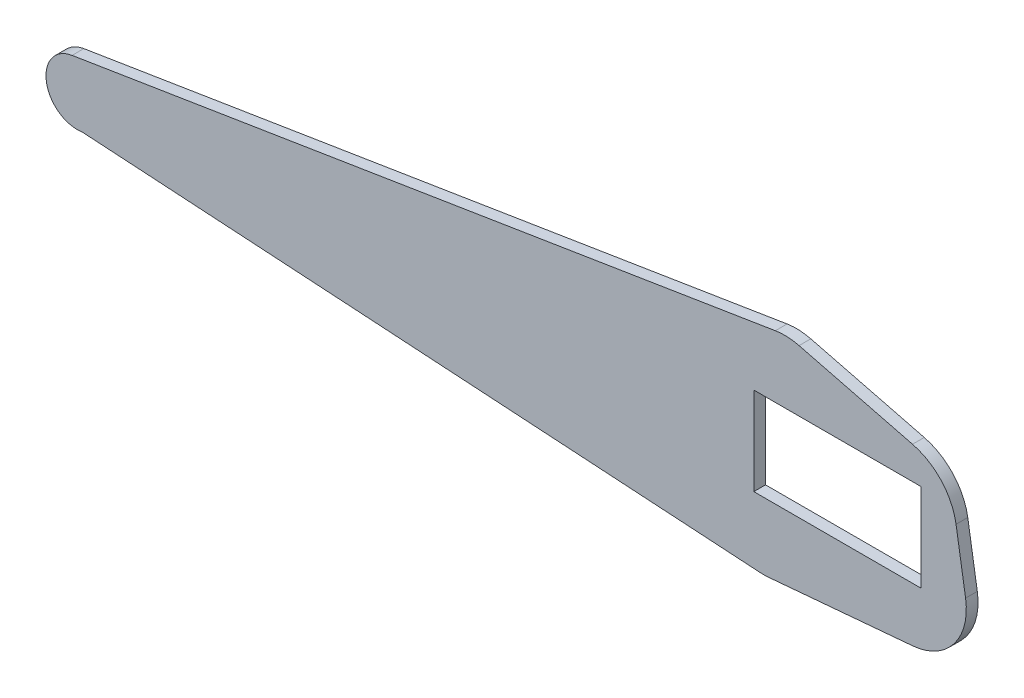
ISO-10303-21;
HEADER;
FILE_DESCRIPTION(('STEP AP214'),'2;1');
FILE_NAME('part.step','',(''),(''),'','','');
FILE_SCHEMA(('AUTOMOTIVE_DESIGN { 1 0 10303 214 1 1 1 1 }'));
ENDSEC;
DATA;
#1=APPLICATION_CONTEXT('core data for automotive mechanical design processes');
#2=APPLICATION_PROTOCOL_DEFINITION('international standard','automotive_design',2000,#1);
#3=PRODUCT_CONTEXT('',#1,'mechanical');
#4=PRODUCT('Part','Part','',(#3));
#5=PRODUCT_RELATED_PRODUCT_CATEGORY('part','',(#4));
#6=PRODUCT_DEFINITION_FORMATION('','',#4);
#7=PRODUCT_DEFINITION_CONTEXT('part definition',#1,'design');
#8=PRODUCT_DEFINITION('design','',#6,#7);
#9=PRODUCT_DEFINITION_SHAPE('','',#8);
#10=(LENGTH_UNIT() NAMED_UNIT(*) SI_UNIT(.MILLI.,.METRE.));
#11=(NAMED_UNIT(*) PLANE_ANGLE_UNIT() SI_UNIT($,.RADIAN.));
#12=(NAMED_UNIT(*) SI_UNIT($,.STERADIAN.) SOLID_ANGLE_UNIT());
#13=UNCERTAINTY_MEASURE_WITH_UNIT(LENGTH_MEASURE(1.E-05),#10,'distance_accuracy_value','');
#14=(GEOMETRIC_REPRESENTATION_CONTEXT(3) GLOBAL_UNCERTAINTY_ASSIGNED_CONTEXT((#13)) GLOBAL_UNIT_ASSIGNED_CONTEXT((#10,
#11,#12)) REPRESENTATION_CONTEXT('',''));
#15=CARTESIAN_POINT('',(0.,0.,0.));
#16=DIRECTION('',(0.,0.,1.));
#17=DIRECTION('',(1.,0.,0.));
#18=AXIS2_PLACEMENT_3D('',#15,#16,#17);
#19=CARTESIAN_POINT('',(-103.698118325608,-5.14144113501677,1.6));
#20=DIRECTION('',(0.,0.,1.));
#21=DIRECTION('',(1.,0.,0.));
#22=AXIS2_PLACEMENT_3D('',#19,#20,#21);
#23=PLANE('',#22);
#24=CARTESIAN_POINT('',(-103.698118325608,-5.14144113501677,1.6));
#25=DIRECTION('',(0.,0.,1.));
#26=DIRECTION('',(1.,0.,0.));
#27=AXIS2_PLACEMENT_3D('',#24,#25,#26);
#28=CIRCLE('',#27,4.23582990680659);
#29=CARTESIAN_POINT('',(-104.371088501529,-0.959412184648588,1.6));
#30=VERTEX_POINT('',#29);
#31=CARTESIAN_POINT('',(-103.025148149686,-9.32347008538495,1.6));
#32=VERTEX_POINT('',#31);
#33=EDGE_CURVE('E168',#30,#32,#28,.T.);
#34=ORIENTED_EDGE('',*,*,#33,.T.);
#35=DIRECTION('',(0.998039277444374,-0.0625907395571467,0.));
#36=VECTOR('',#35,1.);
#37=CARTESIAN_POINT('',(-10.5446241465617,-15.1232662685674,1.6));
#38=LINE('',#37,#36);
#39=CARTESIAN_POINT('',(-10.5446241465617,-15.1232662685674,1.6));
#40=VERTEX_POINT('',#39);
#41=EDGE_CURVE('E171',#32,#40,#38,.T.);
#42=ORIENTED_EDGE('',*,*,#41,.T.);
#43=CARTESIAN_POINT('',(-10.0438982301045,-7.13895204901238,1.6));
#44=DIRECTION('',(0.,0.,1.));
#45=DIRECTION('',(-1.,0.,0.));
#46=AXIS2_PLACEMENT_3D('',#43,#44,#45);
#47=CIRCLE('',#46,8.);
#48=CARTESIAN_POINT('',(-9.34255378012987,-15.1081499987743,1.6));
#49=VERTEX_POINT('',#48);
#50=EDGE_CURVE('E174',#40,#49,#47,.T.);
#51=ORIENTED_EDGE('',*,*,#50,.T.);
#52=DIRECTION('',(0.996149743720242,0.0876680562468202,0.));
#53=VECTOR('',#52,1.);
#54=CARTESIAN_POINT('',(10.2844156812776,-13.3808411543517,1.6));
#55=LINE('',#54,#53);
#56=CARTESIAN_POINT('',(10.2844156812776,-13.3808411543517,1.6));
#57=VERTEX_POINT('',#56);
#58=EDGE_CURVE('E176',#49,#57,#55,.T.);
#59=ORIENTED_EDGE('',*,*,#58,.T.);
#60=CARTESIAN_POINT('',(9.58307123130313,-5.41164320458975,1.6));
#61=DIRECTION('',(0.,0.,1.));
#62=DIRECTION('',(1.,0.,0.));
#63=AXIS2_PLACEMENT_3D('',#60,#61,#62);
#64=CIRCLE('',#63,8.);
#65=CARTESIAN_POINT('',(17.4814600568753,-4.14063810622176,1.6));
#66=VERTEX_POINT('',#65);
#67=EDGE_CURVE('E178',#57,#66,#64,.T.);
#68=ORIENTED_EDGE('',*,*,#67,.T.);
#69=DIRECTION('',(-0.158875637295991,0.987298603196517,0.));
#70=VECTOR('',#69,1.);
#71=CARTESIAN_POINT('',(16.1817821293699,3.93593187184714,1.6));
#72=LINE('',#71,#70);
#73=CARTESIAN_POINT('',(16.1817821293699,3.93593187184714,1.6));
#74=VERTEX_POINT('',#73);
#75=EDGE_CURVE('E180',#66,#74,#72,.T.);
#76=ORIENTED_EDGE('',*,*,#75,.T.);
#77=CARTESIAN_POINT('',(8.28339330379777,2.66492677347925,1.6));
#78=DIRECTION('',(0.,0.,1.));
#79=DIRECTION('',(1.,0.,0.));
#80=AXIS2_PLACEMENT_3D('',#77,#78,#79);
#81=CIRCLE('',#80,8.);
#82=CARTESIAN_POINT('',(10.2441764541634,10.4209134571477,1.6));
#83=VERTEX_POINT('',#82);
#84=EDGE_CURVE('E182',#74,#83,#81,.T.);
#85=ORIENTED_EDGE('',*,*,#84,.T.);
#86=DIRECTION('',(-0.969498335458556,0.245097893795703,0.));
#87=VECTOR('',#86,1.);
#88=CARTESIAN_POINT('',(-5.22744232145128,14.3322777543537,1.6));
#89=LINE('',#88,#87);
#90=CARTESIAN_POINT('',(-5.22744232145128,14.3322777543537,1.6));
#91=VERTEX_POINT('',#90);
#92=EDGE_CURVE('E184',#83,#91,#89,.T.);
#93=ORIENTED_EDGE('',*,*,#92,.T.);
#94=CARTESIAN_POINT('',(-7.18822547181693,6.57629107068522,1.6));
#95=DIRECTION('',(0.,0.,1.));
#96=DIRECTION('',(1.,0.,0.));
#97=AXIS2_PLACEMENT_3D('',#94,#95,#96);
#98=CIRCLE('',#97,8.);
#99=CARTESIAN_POINT('',(-8.45923057018489,14.4746798962573,1.6));
#100=VERTEX_POINT('',#99);
#101=EDGE_CURVE('E186',#91,#100,#98,.T.);
#102=ORIENTED_EDGE('',*,*,#101,.T.);
#103=DIRECTION('',(-0.987298603196517,-0.158875637295991,0.));
#104=VECTOR('',#103,1.);
#105=CARTESIAN_POINT('',(-104.371088501529,-0.959412184648588,1.6));
#106=LINE('',#105,#104);
#107=EDGE_CURVE('E188',#100,#30,#106,.T.);
#108=ORIENTED_EDGE('',*,*,#107,.T.);
#109=EDGE_LOOP('',(#34,#42,#51,#59,#68,#76,#85,#93,#102,#108));
#110=FACE_BOUND('',#109,.T.);
#111=DIRECTION('',(1.,0.,0.));
#112=VECTOR('',#111,1.);
#113=CARTESIAN_POINT('',(11.4,-6.,1.6));
#114=LINE('',#113,#112);
#115=CARTESIAN_POINT('',(-11.4,-6.00000000000001,1.6));
#116=VERTEX_POINT('',#115);
#117=CARTESIAN_POINT('',(11.4,-6.,1.6));
#118=VERTEX_POINT('',#117);
#119=EDGE_CURVE('E140',#116,#118,#114,.T.);
#120=ORIENTED_EDGE('',*,*,#119,.F.);
#121=DIRECTION('',(0.,-1.,0.));
#122=VECTOR('',#121,1.);
#123=CARTESIAN_POINT('',(-11.4,6.,1.6));
#124=LINE('',#123,#122);
#125=CARTESIAN_POINT('',(-11.4,6.,1.6));
#126=VERTEX_POINT('',#125);
#127=EDGE_CURVE('E132',#126,#116,#124,.T.);
#128=ORIENTED_EDGE('',*,*,#127,.F.);
#129=DIRECTION('',(-1.,0.,0.));
#130=VECTOR('',#129,1.);
#131=CARTESIAN_POINT('',(11.4,6.,1.6));
#132=LINE('',#131,#130);
#133=CARTESIAN_POINT('',(11.4,6.,1.6));
#134=VERTEX_POINT('',#133);
#135=EDGE_CURVE('E154',#134,#126,#132,.T.);
#136=ORIENTED_EDGE('',*,*,#135,.F.);
#137=DIRECTION('',(0.,1.,0.));
#138=VECTOR('',#137,1.);
#139=CARTESIAN_POINT('',(11.4,6.,1.6));
#140=LINE('',#139,#138);
#141=EDGE_CURVE('E152',#118,#134,#140,.T.);
#142=ORIENTED_EDGE('',*,*,#141,.F.);
#143=EDGE_LOOP('',(#120,#128,#136,#142));
#144=FACE_BOUND('',#143,.T.);
#145=ADVANCED_FACE('F31',(#110,#144),#23,.T.);
#146=CARTESIAN_POINT('',(-103.698118325608,-5.14144113501677,0.));
#147=DIRECTION('',(0.,0.,1.));
#148=DIRECTION('',(1.,0.,0.));
#149=AXIS2_PLACEMENT_3D('',#146,#147,#148);
#150=PLANE('',#149);
#151=CARTESIAN_POINT('',(-103.698118325608,-5.14144113501677,0.));
#152=DIRECTION('',(0.,0.,1.));
#153=DIRECTION('',(1.,0.,0.));
#154=AXIS2_PLACEMENT_3D('',#151,#152,#153);
#155=CIRCLE('',#154,4.23582990680659);
#156=CARTESIAN_POINT('',(-104.371088501529,-0.959412184648588,0.));
#157=VERTEX_POINT('',#156);
#158=CARTESIAN_POINT('',(-103.025148149686,-9.32347008538495,0.));
#159=VERTEX_POINT('',#158);
#160=EDGE_CURVE('E148',#157,#159,#155,.T.);
#161=ORIENTED_EDGE('',*,*,#160,.F.);
#162=DIRECTION('',(-0.987298603196517,-0.158875637295991,0.));
#163=VECTOR('',#162,1.);
#164=CARTESIAN_POINT('',(-104.371088501529,-0.959412184648588,0.));
#165=LINE('',#164,#163);
#166=CARTESIAN_POINT('',(-8.45923057018489,14.4746798962573,0.));
#167=VERTEX_POINT('',#166);
#168=EDGE_CURVE('E172',#167,#157,#165,.T.);
#169=ORIENTED_EDGE('',*,*,#168,.F.);
#170=CARTESIAN_POINT('',(-7.18822547181693,6.57629107068522,0.));
#171=DIRECTION('',(0.,0.,1.));
#172=DIRECTION('',(1.,0.,0.));
#173=AXIS2_PLACEMENT_3D('',#170,#171,#172);
#174=CIRCLE('',#173,8.);
#175=CARTESIAN_POINT('',(-5.22744232145128,14.3322777543537,0.));
#176=VERTEX_POINT('',#175);
#177=EDGE_CURVE('E207',#176,#167,#174,.T.);
#178=ORIENTED_EDGE('',*,*,#177,.F.);
#179=DIRECTION('',(-0.969498335458556,0.245097893795703,0.));
#180=VECTOR('',#179,1.);
#181=CARTESIAN_POINT('',(-5.22744232145128,14.3322777543537,0.));
#182=LINE('',#181,#180);
#183=CARTESIAN_POINT('',(10.2441764541634,10.4209134571477,0.));
#184=VERTEX_POINT('',#183);
#185=EDGE_CURVE('E205',#184,#176,#182,.T.);
#186=ORIENTED_EDGE('',*,*,#185,.F.);
#187=CARTESIAN_POINT('',(8.28339330379777,2.66492677347925,0.));
#188=DIRECTION('',(0.,0.,1.));
#189=DIRECTION('',(1.,0.,0.));
#190=AXIS2_PLACEMENT_3D('',#187,#188,#189);
#191=CIRCLE('',#190,8.);
#192=CARTESIAN_POINT('',(16.1817821293699,3.93593187184714,0.));
#193=VERTEX_POINT('',#192);
#194=EDGE_CURVE('E203',#193,#184,#191,.T.);
#195=ORIENTED_EDGE('',*,*,#194,.F.);
#196=DIRECTION('',(-0.158875637295991,0.987298603196517,0.));
#197=VECTOR('',#196,1.);
#198=CARTESIAN_POINT('',(16.1817821293699,3.93593187184714,0.));
#199=LINE('',#198,#197);
#200=CARTESIAN_POINT('',(17.4814600568753,-4.14063810622176,0.));
#201=VERTEX_POINT('',#200);
#202=EDGE_CURVE('E201',#201,#193,#199,.T.);
#203=ORIENTED_EDGE('',*,*,#202,.F.);
#204=CARTESIAN_POINT('',(9.58307123130313,-5.41164320458975,0.));
#205=DIRECTION('',(0.,0.,1.));
#206=DIRECTION('',(1.,0.,0.));
#207=AXIS2_PLACEMENT_3D('',#204,#205,#206);
#208=CIRCLE('',#207,8.);
#209=CARTESIAN_POINT('',(10.2844156812776,-13.3808411543517,0.));
#210=VERTEX_POINT('',#209);
#211=EDGE_CURVE('E199',#210,#201,#208,.T.);
#212=ORIENTED_EDGE('',*,*,#211,.F.);
#213=DIRECTION('',(0.996149743720242,0.0876680562468202,0.));
#214=VECTOR('',#213,1.);
#215=CARTESIAN_POINT('',(10.2844156812776,-13.3808411543517,0.));
#216=LINE('',#215,#214);
#217=CARTESIAN_POINT('',(-9.34255378012987,-15.1081499987743,0.));
#218=VERTEX_POINT('',#217);
#219=EDGE_CURVE('E197',#218,#210,#216,.T.);
#220=ORIENTED_EDGE('',*,*,#219,.F.);
#221=CARTESIAN_POINT('',(-10.0438982301045,-7.13895204901238,0.));
#222=DIRECTION('',(0.,0.,1.));
#223=DIRECTION('',(-1.,0.,0.));
#224=AXIS2_PLACEMENT_3D('',#221,#222,#223);
#225=CIRCLE('',#224,8.);
#226=CARTESIAN_POINT('',(-10.5446241465617,-15.1232662685674,0.));
#227=VERTEX_POINT('',#226);
#228=EDGE_CURVE('E195',#227,#218,#225,.T.);
#229=ORIENTED_EDGE('',*,*,#228,.F.);
#230=DIRECTION('',(0.998039277444374,-0.0625907395571467,0.));
#231=VECTOR('',#230,1.);
#232=CARTESIAN_POINT('',(-10.5446241465617,-15.1232662685674,0.));
#233=LINE('',#232,#231);
#234=EDGE_CURVE('E193',#159,#227,#233,.T.);
#235=ORIENTED_EDGE('',*,*,#234,.F.);
#236=EDGE_LOOP('',(#161,#169,#178,#186,#195,#203,#212,#220,#229,#235));
#237=FACE_BOUND('',#236,.T.);
#238=DIRECTION('',(0.,-1.,0.));
#239=VECTOR('',#238,1.);
#240=CARTESIAN_POINT('',(-11.4,6.,0.));
#241=LINE('',#240,#239);
#242=CARTESIAN_POINT('',(-11.4,6.,0.));
#243=VERTEX_POINT('',#242);
#244=CARTESIAN_POINT('',(-11.4,-6.00000000000001,0.));
#245=VERTEX_POINT('',#244);
#246=EDGE_CURVE('E54',#243,#245,#241,.T.);
#247=ORIENTED_EDGE('',*,*,#246,.T.);
#248=DIRECTION('',(1.,0.,0.));
#249=VECTOR('',#248,1.);
#250=CARTESIAN_POINT('',(11.4,-6.,0.));
#251=LINE('',#250,#249);
#252=CARTESIAN_POINT('',(11.4,-6.,0.));
#253=VERTEX_POINT('',#252);
#254=EDGE_CURVE('E147',#245,#253,#251,.T.);
#255=ORIENTED_EDGE('',*,*,#254,.T.);
#256=DIRECTION('',(0.,1.,0.));
#257=VECTOR('',#256,1.);
#258=CARTESIAN_POINT('',(11.4,6.,0.));
#259=LINE('',#258,#257);
#260=CARTESIAN_POINT('',(11.4,6.,0.));
#261=VERTEX_POINT('',#260);
#262=EDGE_CURVE('E160',#253,#261,#259,.T.);
#263=ORIENTED_EDGE('',*,*,#262,.T.);
#264=DIRECTION('',(-1.,0.,0.));
#265=VECTOR('',#264,1.);
#266=CARTESIAN_POINT('',(11.4,6.,0.));
#267=LINE('',#266,#265);
#268=EDGE_CURVE('E141',#261,#243,#267,.T.);
#269=ORIENTED_EDGE('',*,*,#268,.T.);
#270=EDGE_LOOP('',(#247,#255,#263,#269));
#271=FACE_BOUND('',#270,.T.);
#272=ADVANCED_FACE('F243',(#237,#271),#150,.F.);
#273=CARTESIAN_POINT('',(-103.698118325608,-5.14144113501677,1.6));
#274=DIRECTION('',(0.,0.,-1.));
#275=DIRECTION('',(-1.,0.,0.));
#276=AXIS2_PLACEMENT_3D('',#273,#274,#275);
#277=CYLINDRICAL_SURFACE('',#276,4.23582990680659);
#278=ORIENTED_EDGE('',*,*,#160,.T.);
#279=DIRECTION('',(0.,0.,-1.));
#280=VECTOR('',#279,1.);
#281=CARTESIAN_POINT('',(-103.025148149686,-9.32347008538495,1.6));
#282=LINE('',#281,#280);
#283=EDGE_CURVE('E11',#32,#159,#282,.T.);
#284=ORIENTED_EDGE('',*,*,#283,.F.);
#285=ORIENTED_EDGE('',*,*,#33,.F.);
#286=DIRECTION('',(0.,0.,-1.));
#287=VECTOR('',#286,1.);
#288=CARTESIAN_POINT('',(-104.371088501529,-0.959412184648588,1.6));
#289=LINE('',#288,#287);
#290=EDGE_CURVE('E190',#30,#157,#289,.T.);
#291=ORIENTED_EDGE('',*,*,#290,.T.);
#292=EDGE_LOOP('',(#278,#284,#285,#291));
#293=FACE_BOUND('',#292,.T.);
#294=ADVANCED_FACE('F33',(#293),#277,.T.);
#295=CARTESIAN_POINT('',(-10.5446241465617,-15.1232662685674,1.6));
#296=DIRECTION('',(0.0625907395571467,0.998039277444375,0.));
#297=DIRECTION('',(-0.998039277444375,0.0625907395571467,0.));
#298=AXIS2_PLACEMENT_3D('',#295,#296,#297);
#299=PLANE('',#298);
#300=ORIENTED_EDGE('',*,*,#234,.T.);
#301=DIRECTION('',(0.,0.,-1.));
#302=VECTOR('',#301,1.);
#303=CARTESIAN_POINT('',(-10.5446241465617,-15.1232662685674,1.6));
#304=LINE('',#303,#302);
#305=EDGE_CURVE('E39',#40,#227,#304,.T.);
#306=ORIENTED_EDGE('',*,*,#305,.F.);
#307=ORIENTED_EDGE('',*,*,#41,.F.);
#308=ORIENTED_EDGE('',*,*,#283,.T.);
#309=EDGE_LOOP('',(#300,#306,#307,#308));
#310=FACE_BOUND('',#309,.T.);
#311=ADVANCED_FACE('F260',(#310),#299,.F.);
#312=CARTESIAN_POINT('',(-10.0438982301045,-7.13895204901238,1.6));
#313=DIRECTION('',(0.,0.,-1.));
#314=DIRECTION('',(-1.,0.,0.));
#315=AXIS2_PLACEMENT_3D('',#312,#313,#314);
#316=CYLINDRICAL_SURFACE('',#315,8.);
#317=ORIENTED_EDGE('',*,*,#228,.T.);
#318=DIRECTION('',(0.,0.,-1.));
#319=VECTOR('',#318,1.);
#320=CARTESIAN_POINT('',(-9.34255378012987,-15.1081499987743,1.6));
#321=LINE('',#320,#319);
#322=EDGE_CURVE('E230',#49,#218,#321,.T.);
#323=ORIENTED_EDGE('',*,*,#322,.F.);
#324=ORIENTED_EDGE('',*,*,#50,.F.);
#325=ORIENTED_EDGE('',*,*,#305,.T.);
#326=EDGE_LOOP('',(#317,#323,#324,#325));
#327=FACE_BOUND('',#326,.T.);
#328=ADVANCED_FACE('F237',(#327),#316,.T.);
#329=CARTESIAN_POINT('',(10.2844156812776,-13.3808411543517,1.6));
#330=DIRECTION('',(-0.0876680562468202,0.996149743720242,0.));
#331=DIRECTION('',(-0.996149743720242,-0.0876680562468203,0.));
#332=AXIS2_PLACEMENT_3D('',#329,#330,#331);
#333=PLANE('',#332);
#334=ORIENTED_EDGE('',*,*,#219,.T.);
#335=DIRECTION('',(0.,0.,-1.));
#336=VECTOR('',#335,1.);
#337=CARTESIAN_POINT('',(10.2844156812776,-13.3808411543517,1.6));
#338=LINE('',#337,#336);
#339=EDGE_CURVE('E227',#57,#210,#338,.T.);
#340=ORIENTED_EDGE('',*,*,#339,.F.);
#341=ORIENTED_EDGE('',*,*,#58,.F.);
#342=ORIENTED_EDGE('',*,*,#322,.T.);
#343=EDGE_LOOP('',(#334,#340,#341,#342));
#344=FACE_BOUND('',#343,.T.);
#345=ADVANCED_FACE('F249',(#344),#333,.F.);
#346=CARTESIAN_POINT('',(9.58307123130313,-5.41164320458975,1.6));
#347=DIRECTION('',(0.,0.,-1.));
#348=DIRECTION('',(-1.,0.,0.));
#349=AXIS2_PLACEMENT_3D('',#346,#347,#348);
#350=CYLINDRICAL_SURFACE('',#349,8.);
#351=ORIENTED_EDGE('',*,*,#211,.T.);
#352=DIRECTION('',(0.,0.,-1.));
#353=VECTOR('',#352,1.);
#354=CARTESIAN_POINT('',(17.4814600568753,-4.14063810622176,1.6));
#355=LINE('',#354,#353);
#356=EDGE_CURVE('E224',#66,#201,#355,.T.);
#357=ORIENTED_EDGE('',*,*,#356,.F.);
#358=ORIENTED_EDGE('',*,*,#67,.F.);
#359=ORIENTED_EDGE('',*,*,#339,.T.);
#360=EDGE_LOOP('',(#351,#357,#358,#359));
#361=FACE_BOUND('',#360,.T.);
#362=ADVANCED_FACE('F253',(#361),#350,.T.);
#363=CARTESIAN_POINT('',(16.1817821293699,3.93593187184714,1.6));
#364=DIRECTION('',(-0.987298603196517,-0.158875637295991,0.));
#365=DIRECTION('',(0.158875637295991,-0.987298603196517,0.));
#366=AXIS2_PLACEMENT_3D('',#363,#364,#365);
#367=PLANE('',#366);
#368=ORIENTED_EDGE('',*,*,#202,.T.);
#369=DIRECTION('',(0.,0.,-1.));
#370=VECTOR('',#369,1.);
#371=CARTESIAN_POINT('',(16.1817821293699,3.93593187184714,1.6));
#372=LINE('',#371,#370);
#373=EDGE_CURVE('E221',#74,#193,#372,.T.);
#374=ORIENTED_EDGE('',*,*,#373,.F.);
#375=ORIENTED_EDGE('',*,*,#75,.F.);
#376=ORIENTED_EDGE('',*,*,#356,.T.);
#377=EDGE_LOOP('',(#368,#374,#375,#376));
#378=FACE_BOUND('',#377,.T.);
#379=ADVANCED_FACE('F283',(#378),#367,.F.);
#380=CARTESIAN_POINT('',(8.28339330379777,2.66492677347925,1.6));
#381=DIRECTION('',(0.,0.,-1.));
#382=DIRECTION('',(-1.,0.,0.));
#383=AXIS2_PLACEMENT_3D('',#380,#381,#382);
#384=CYLINDRICAL_SURFACE('',#383,8.);
#385=ORIENTED_EDGE('',*,*,#194,.T.);
#386=DIRECTION('',(0.,0.,-1.));
#387=VECTOR('',#386,1.);
#388=CARTESIAN_POINT('',(10.2441764541634,10.4209134571477,1.6));
#389=LINE('',#388,#387);
#390=EDGE_CURVE('E218',#83,#184,#389,.T.);
#391=ORIENTED_EDGE('',*,*,#390,.F.);
#392=ORIENTED_EDGE('',*,*,#84,.F.);
#393=ORIENTED_EDGE('',*,*,#373,.T.);
#394=EDGE_LOOP('',(#385,#391,#392,#393));
#395=FACE_BOUND('',#394,.T.);
#396=ADVANCED_FACE('F280',(#395),#384,.T.);
#397=CARTESIAN_POINT('',(-5.22744232145128,14.3322777543537,1.6));
#398=DIRECTION('',(-0.245097893795703,-0.969498335458556,0.));
#399=DIRECTION('',(0.969498335458556,-0.245097893795703,0.));
#400=AXIS2_PLACEMENT_3D('',#397,#398,#399);
#401=PLANE('',#400);
#402=ORIENTED_EDGE('',*,*,#185,.T.);
#403=DIRECTION('',(0.,0.,-1.));
#404=VECTOR('',#403,1.);
#405=CARTESIAN_POINT('',(-5.22744232145128,14.3322777543537,1.6));
#406=LINE('',#405,#404);
#407=EDGE_CURVE('E215',#91,#176,#406,.T.);
#408=ORIENTED_EDGE('',*,*,#407,.F.);
#409=ORIENTED_EDGE('',*,*,#92,.F.);
#410=ORIENTED_EDGE('',*,*,#390,.T.);
#411=EDGE_LOOP('',(#402,#408,#409,#410));
#412=FACE_BOUND('',#411,.T.);
#413=ADVANCED_FACE('F276',(#412),#401,.F.);
#414=CARTESIAN_POINT('',(-7.18822547181693,6.57629107068522,1.6));
#415=DIRECTION('',(0.,0.,-1.));
#416=DIRECTION('',(-1.,0.,0.));
#417=AXIS2_PLACEMENT_3D('',#414,#415,#416);
#418=CYLINDRICAL_SURFACE('',#417,8.);
#419=ORIENTED_EDGE('',*,*,#177,.T.);
#420=DIRECTION('',(0.,0.,-1.));
#421=VECTOR('',#420,1.);
#422=CARTESIAN_POINT('',(-8.45923057018489,14.4746798962573,1.6));
#423=LINE('',#422,#421);
#424=EDGE_CURVE('E212',#100,#167,#423,.T.);
#425=ORIENTED_EDGE('',*,*,#424,.F.);
#426=ORIENTED_EDGE('',*,*,#101,.F.);
#427=ORIENTED_EDGE('',*,*,#407,.T.);
#428=EDGE_LOOP('',(#419,#425,#426,#427));
#429=FACE_BOUND('',#428,.T.);
#430=ADVANCED_FACE('F272',(#429),#418,.T.);
#431=CARTESIAN_POINT('',(-104.371088501529,-0.959412184648588,1.6));
#432=DIRECTION('',(0.158875637295991,-0.987298603196517,0.));
#433=DIRECTION('',(0.987298603196517,0.158875637295991,0.));
#434=AXIS2_PLACEMENT_3D('',#431,#432,#433);
#435=PLANE('',#434);
#436=ORIENTED_EDGE('',*,*,#168,.T.);
#437=ORIENTED_EDGE('',*,*,#290,.F.);
#438=ORIENTED_EDGE('',*,*,#107,.F.);
#439=ORIENTED_EDGE('',*,*,#424,.T.);
#440=EDGE_LOOP('',(#436,#437,#438,#439));
#441=FACE_BOUND('',#440,.T.);
#442=ADVANCED_FACE('F267',(#441),#435,.F.);
#443=CARTESIAN_POINT('',(-11.4,6.,1.6));
#444=DIRECTION('',(1.,0.,0.));
#445=DIRECTION('',(0.,1.,0.));
#446=AXIS2_PLACEMENT_3D('',#443,#444,#445);
#447=PLANE('',#446);
#448=ORIENTED_EDGE('',*,*,#246,.F.);
#449=DIRECTION('',(0.,0.,-1.));
#450=VECTOR('',#449,1.);
#451=CARTESIAN_POINT('',(-11.4,6.,1.6));
#452=LINE('',#451,#450);
#453=EDGE_CURVE('E136',#126,#243,#452,.T.);
#454=ORIENTED_EDGE('',*,*,#453,.F.);
#455=ORIENTED_EDGE('',*,*,#127,.T.);
#456=DIRECTION('',(0.,0.,-1.));
#457=VECTOR('',#456,1.);
#458=CARTESIAN_POINT('',(-11.4,-6.00000000000001,1.6));
#459=LINE('',#458,#457);
#460=EDGE_CURVE('E135',#116,#245,#459,.T.);
#461=ORIENTED_EDGE('',*,*,#460,.T.);
#462=EDGE_LOOP('',(#448,#454,#455,#461));
#463=FACE_BOUND('',#462,.T.);
#464=ADVANCED_FACE('F134',(#463),#447,.T.);
#465=CARTESIAN_POINT('',(11.4,-6.,1.6));
#466=DIRECTION('',(0.,1.,0.));
#467=DIRECTION('',(-1.,0.,0.));
#468=AXIS2_PLACEMENT_3D('',#465,#466,#467);
#469=PLANE('',#468);
#470=ORIENTED_EDGE('',*,*,#254,.F.);
#471=ORIENTED_EDGE('',*,*,#460,.F.);
#472=ORIENTED_EDGE('',*,*,#119,.T.);
#473=DIRECTION('',(0.,0.,-1.));
#474=VECTOR('',#473,1.);
#475=CARTESIAN_POINT('',(11.4,-6.,1.6));
#476=LINE('',#475,#474);
#477=EDGE_CURVE('E149',#118,#253,#476,.T.);
#478=ORIENTED_EDGE('',*,*,#477,.T.);
#479=EDGE_LOOP('',(#470,#471,#472,#478));
#480=FACE_BOUND('',#479,.T.);
#481=ADVANCED_FACE('F144',(#480),#469,.T.);
#482=CARTESIAN_POINT('',(11.4,6.,1.6));
#483=DIRECTION('',(-1.,0.,0.));
#484=DIRECTION('',(0.,-1.,0.));
#485=AXIS2_PLACEMENT_3D('',#482,#483,#484);
#486=PLANE('',#485);
#487=ORIENTED_EDGE('',*,*,#262,.F.);
#488=ORIENTED_EDGE('',*,*,#477,.F.);
#489=ORIENTED_EDGE('',*,*,#141,.T.);
#490=DIRECTION('',(0.,0.,-1.));
#491=VECTOR('',#490,1.);
#492=CARTESIAN_POINT('',(11.4,6.,1.6));
#493=LINE('',#492,#491);
#494=EDGE_CURVE('E46',#134,#261,#493,.T.);
#495=ORIENTED_EDGE('',*,*,#494,.T.);
#496=EDGE_LOOP('',(#487,#488,#489,#495));
#497=FACE_BOUND('',#496,.T.);
#498=ADVANCED_FACE('F329',(#497),#486,.T.);
#499=CARTESIAN_POINT('',(11.4,6.,1.6));
#500=DIRECTION('',(0.,-1.,0.));
#501=DIRECTION('',(1.,0.,0.));
#502=AXIS2_PLACEMENT_3D('',#499,#500,#501);
#503=PLANE('',#502);
#504=ORIENTED_EDGE('',*,*,#268,.F.);
#505=ORIENTED_EDGE('',*,*,#494,.F.);
#506=ORIENTED_EDGE('',*,*,#135,.T.);
#507=ORIENTED_EDGE('',*,*,#453,.T.);
#508=EDGE_LOOP('',(#504,#505,#506,#507));
#509=FACE_BOUND('',#508,.T.);
#510=ADVANCED_FACE('F335',(#509),#503,.T.);
#511=CLOSED_SHELL('',(#145,#272,#294,#311,#328,#345,#362,#379,#396,#413,#430,#442,#464,#481,
#498,#510));
#512=MANIFOLD_SOLID_BREP('B2',#511);
#513=ADVANCED_BREP_SHAPE_REPRESENTATION('',(#18,#512),#14);
#514=SHAPE_DEFINITION_REPRESENTATION(#9,#513);
ENDSEC;
END-ISO-10303-21;
